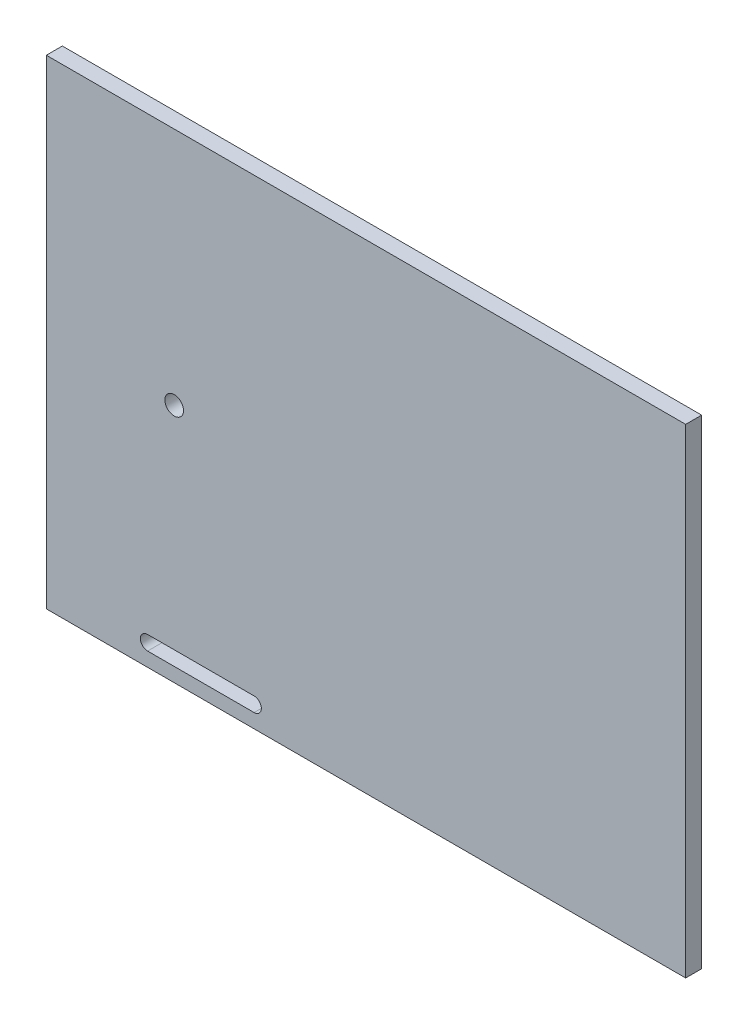
ISO-10303-21;
HEADER;
FILE_DESCRIPTION(('STEP AP214'),'2;1');
FILE_NAME('part.step','',(''),(''),'','','');
FILE_SCHEMA(('AUTOMOTIVE_DESIGN { 1 0 10303 214 1 1 1 1 }'));
ENDSEC;
DATA;
#1=APPLICATION_CONTEXT('core data for automotive mechanical design processes');
#2=APPLICATION_PROTOCOL_DEFINITION('international standard','automotive_design',2000,#1);
#3=PRODUCT_CONTEXT('',#1,'mechanical');
#4=PRODUCT('Part','Part','',(#3));
#5=PRODUCT_RELATED_PRODUCT_CATEGORY('part','',(#4));
#6=PRODUCT_DEFINITION_FORMATION('','',#4);
#7=PRODUCT_DEFINITION_CONTEXT('part definition',#1,'design');
#8=PRODUCT_DEFINITION('design','',#6,#7);
#9=PRODUCT_DEFINITION_SHAPE('','',#8);
#10=(LENGTH_UNIT() NAMED_UNIT(*) SI_UNIT(.MILLI.,.METRE.));
#11=(NAMED_UNIT(*) PLANE_ANGLE_UNIT() SI_UNIT($,.RADIAN.));
#12=(NAMED_UNIT(*) SI_UNIT($,.STERADIAN.) SOLID_ANGLE_UNIT());
#13=UNCERTAINTY_MEASURE_WITH_UNIT(LENGTH_MEASURE(1.E-05),#10,'distance_accuracy_value','');
#14=(GEOMETRIC_REPRESENTATION_CONTEXT(3) GLOBAL_UNCERTAINTY_ASSIGNED_CONTEXT((#13)) GLOBAL_UNIT_ASSIGNED_CONTEXT((#10,
#11,#12)) REPRESENTATION_CONTEXT('',''));
#15=CARTESIAN_POINT('',(0.,0.,0.));
#16=DIRECTION('',(0.,0.,1.));
#17=DIRECTION('',(1.,0.,0.));
#18=AXIS2_PLACEMENT_3D('',#15,#16,#17);
#19=CARTESIAN_POINT('',(120.,0.,3.));
#20=DIRECTION('',(1.,0.,0.));
#21=DIRECTION('',(0.,1.,0.));
#22=AXIS2_PLACEMENT_3D('',#19,#20,#21);
#23=PLANE('',#22);
#24=DIRECTION('',(0.,-1.,0.));
#25=VECTOR('',#24,1.);
#26=CARTESIAN_POINT('',(120.,0.,0.));
#27=LINE('',#26,#25);
#28=CARTESIAN_POINT('',(120.,0.,0.));
#29=VERTEX_POINT('',#28);
#30=CARTESIAN_POINT('',(120.,-90.,0.));
#31=VERTEX_POINT('',#30);
#32=EDGE_CURVE('E154',#29,#31,#27,.T.);
#33=ORIENTED_EDGE('',*,*,#32,.F.);
#34=DIRECTION('',(0.,0.,-1.));
#35=VECTOR('',#34,1.);
#36=CARTESIAN_POINT('',(120.,0.,3.));
#37=LINE('',#36,#35);
#38=CARTESIAN_POINT('',(120.,0.,3.));
#39=VERTEX_POINT('',#38);
#40=EDGE_CURVE('E11',#39,#29,#37,.T.);
#41=ORIENTED_EDGE('',*,*,#40,.F.);
#42=DIRECTION('',(0.,-1.,0.));
#43=VECTOR('',#42,1.);
#44=CARTESIAN_POINT('',(120.,0.,3.));
#45=LINE('',#44,#43);
#46=CARTESIAN_POINT('',(120.,-90.,3.));
#47=VERTEX_POINT('',#46);
#48=EDGE_CURVE('E155',#39,#47,#45,.T.);
#49=ORIENTED_EDGE('',*,*,#48,.T.);
#50=DIRECTION('',(0.,0.,-1.));
#51=VECTOR('',#50,1.);
#52=CARTESIAN_POINT('',(120.,-90.,3.));
#53=LINE('',#52,#51);
#54=EDGE_CURVE('E170',#47,#31,#53,.T.);
#55=ORIENTED_EDGE('',*,*,#54,.T.);
#56=EDGE_LOOP('',(#33,#41,#49,#55));
#57=FACE_BOUND('',#56,.T.);
#58=ADVANCED_FACE('F43',(#57),#23,.T.);
#59=CARTESIAN_POINT('',(0.,0.,3.));
#60=DIRECTION('',(0.,1.,0.));
#61=DIRECTION('',(-1.,0.,0.));
#62=AXIS2_PLACEMENT_3D('',#59,#60,#61);
#63=PLANE('',#62);
#64=DIRECTION('',(1.,0.,0.));
#65=VECTOR('',#64,1.);
#66=CARTESIAN_POINT('',(0.,0.,0.));
#67=LINE('',#66,#65);
#68=CARTESIAN_POINT('',(0.,0.,0.));
#69=VERTEX_POINT('',#68);
#70=EDGE_CURVE('E174',#69,#29,#67,.T.);
#71=ORIENTED_EDGE('',*,*,#70,.F.);
#72=DIRECTION('',(0.,0.,-1.));
#73=VECTOR('',#72,1.);
#74=CARTESIAN_POINT('',(0.,0.,3.));
#75=LINE('',#74,#73);
#76=CARTESIAN_POINT('',(0.,0.,3.));
#77=VERTEX_POINT('',#76);
#78=EDGE_CURVE('E51',#77,#69,#75,.T.);
#79=ORIENTED_EDGE('',*,*,#78,.F.);
#80=DIRECTION('',(1.,0.,0.));
#81=VECTOR('',#80,1.);
#82=CARTESIAN_POINT('',(0.,0.,3.));
#83=LINE('',#82,#81);
#84=EDGE_CURVE('E159',#77,#39,#83,.T.);
#85=ORIENTED_EDGE('',*,*,#84,.T.);
#86=ORIENTED_EDGE('',*,*,#40,.T.);
#87=EDGE_LOOP('',(#71,#79,#85,#86));
#88=FACE_BOUND('',#87,.T.);
#89=ADVANCED_FACE('F201',(#88),#63,.T.);
#90=CARTESIAN_POINT('',(0.,0.,3.));
#91=DIRECTION('',(1.,0.,0.));
#92=DIRECTION('',(0.,1.,0.));
#93=AXIS2_PLACEMENT_3D('',#90,#91,#92);
#94=PLANE('',#93);
#95=DIRECTION('',(0.,-1.,0.));
#96=VECTOR('',#95,1.);
#97=CARTESIAN_POINT('',(0.,0.,0.));
#98=LINE('',#97,#96);
#99=CARTESIAN_POINT('',(0.,-90.,0.));
#100=VERTEX_POINT('',#99);
#101=EDGE_CURVE('E178',#69,#100,#98,.T.);
#102=ORIENTED_EDGE('',*,*,#101,.T.);
#103=DIRECTION('',(0.,0.,-1.));
#104=VECTOR('',#103,1.);
#105=CARTESIAN_POINT('',(0.,-90.,3.));
#106=LINE('',#105,#104);
#107=CARTESIAN_POINT('',(0.,-90.,3.));
#108=VERTEX_POINT('',#107);
#109=EDGE_CURVE('E186',#108,#100,#106,.T.);
#110=ORIENTED_EDGE('',*,*,#109,.F.);
#111=DIRECTION('',(0.,-1.,0.));
#112=VECTOR('',#111,1.);
#113=CARTESIAN_POINT('',(0.,0.,3.));
#114=LINE('',#113,#112);
#115=EDGE_CURVE('E164',#77,#108,#114,.T.);
#116=ORIENTED_EDGE('',*,*,#115,.F.);
#117=ORIENTED_EDGE('',*,*,#78,.T.);
#118=EDGE_LOOP('',(#102,#110,#116,#117));
#119=FACE_BOUND('',#118,.T.);
#120=ADVANCED_FACE('F193',(#119),#94,.F.);
#121=CARTESIAN_POINT('',(0.,-90.,3.));
#122=DIRECTION('',(0.,1.,0.));
#123=DIRECTION('',(-1.,0.,0.));
#124=AXIS2_PLACEMENT_3D('',#121,#122,#123);
#125=PLANE('',#124);
#126=DIRECTION('',(1.,0.,0.));
#127=VECTOR('',#126,1.);
#128=CARTESIAN_POINT('',(0.,-90.,0.));
#129=LINE('',#128,#127);
#130=EDGE_CURVE('E160',#100,#31,#129,.T.);
#131=ORIENTED_EDGE('',*,*,#130,.T.);
#132=ORIENTED_EDGE('',*,*,#54,.F.);
#133=DIRECTION('',(1.,0.,0.));
#134=VECTOR('',#133,1.);
#135=CARTESIAN_POINT('',(0.,-90.,3.));
#136=LINE('',#135,#134);
#137=EDGE_CURVE('E167',#108,#47,#136,.T.);
#138=ORIENTED_EDGE('',*,*,#137,.F.);
#139=ORIENTED_EDGE('',*,*,#109,.T.);
#140=EDGE_LOOP('',(#131,#132,#138,#139));
#141=FACE_BOUND('',#140,.T.);
#142=ADVANCED_FACE('F208',(#141),#125,.F.);
#143=CARTESIAN_POINT('',(0.,0.,3.));
#144=DIRECTION('',(0.,0.,1.));
#145=DIRECTION('',(1.,0.,0.));
#146=AXIS2_PLACEMENT_3D('',#143,#144,#145);
#147=PLANE('',#146);
#148=DIRECTION('',(1.,0.,0.));
#149=VECTOR('',#148,1.);
#150=CARTESIAN_POINT('',(0.,-87.35,3.));
#151=LINE('',#150,#149);
#152=CARTESIAN_POINT('',(19.,-87.35,3.));
#153=VERTEX_POINT('',#152);
#154=CARTESIAN_POINT('',(39.,-87.35,3.));
#155=VERTEX_POINT('',#154);
#156=EDGE_CURVE('E58',#153,#155,#151,.T.);
#157=ORIENTED_EDGE('',*,*,#156,.F.);
#158=CARTESIAN_POINT('',(19.,-86.,3.));
#159=DIRECTION('',(0.,0.,1.));
#160=DIRECTION('',(1.,0.,0.));
#161=AXIS2_PLACEMENT_3D('',#158,#159,#160);
#162=CIRCLE('',#161,1.35);
#163=CARTESIAN_POINT('',(19.,-84.65,3.));
#164=VERTEX_POINT('',#163);
#165=EDGE_CURVE('E128',#164,#153,#162,.T.);
#166=ORIENTED_EDGE('',*,*,#165,.F.);
#167=DIRECTION('',(1.,0.,0.));
#168=VECTOR('',#167,1.);
#169=CARTESIAN_POINT('',(0.,-84.65,3.));
#170=LINE('',#169,#168);
#171=CARTESIAN_POINT('',(39.,-84.65,3.));
#172=VERTEX_POINT('',#171);
#173=EDGE_CURVE('E110',#164,#172,#170,.T.);
#174=ORIENTED_EDGE('',*,*,#173,.T.);
#175=CARTESIAN_POINT('',(39.,-86.,3.));
#176=DIRECTION('',(0.,0.,1.));
#177=DIRECTION('',(1.,0.,0.));
#178=AXIS2_PLACEMENT_3D('',#175,#176,#177);
#179=CIRCLE('',#178,1.35);
#180=EDGE_CURVE('E120',#155,#172,#179,.T.);
#181=ORIENTED_EDGE('',*,*,#180,.F.);
#182=EDGE_LOOP('',(#157,#166,#174,#181));
#183=FACE_BOUND('',#182,.T.);
#184=CARTESIAN_POINT('',(24.,-44.9,3.));
#185=DIRECTION('',(0.,0.,1.));
#186=DIRECTION('',(1.,0.,0.));
#187=AXIS2_PLACEMENT_3D('',#184,#185,#186);
#188=CIRCLE('',#187,1.75);
#189=CARTESIAN_POINT('',(25.75,-44.9,3.));
#190=VERTEX_POINT('',#189);
#191=EDGE_CURVE('E145',#190,#190,#188,.T.);
#192=ORIENTED_EDGE('',*,*,#191,.F.);
#193=EDGE_LOOP('',(#192));
#194=FACE_BOUND('',#193,.T.);
#195=ORIENTED_EDGE('',*,*,#48,.F.);
#196=ORIENTED_EDGE('',*,*,#84,.F.);
#197=ORIENTED_EDGE('',*,*,#115,.T.);
#198=ORIENTED_EDGE('',*,*,#137,.T.);
#199=EDGE_LOOP('',(#195,#196,#197,#198));
#200=FACE_BOUND('',#199,.T.);
#201=ADVANCED_FACE('F125',(#183,#194,#200),#147,.T.);
#202=CARTESIAN_POINT('',(0.,0.,0.));
#203=DIRECTION('',(0.,0.,1.));
#204=DIRECTION('',(1.,0.,0.));
#205=AXIS2_PLACEMENT_3D('',#202,#203,#204);
#206=PLANE('',#205);
#207=CARTESIAN_POINT('',(19.,-86.,0.));
#208=DIRECTION('',(0.,0.,1.));
#209=DIRECTION('',(1.,0.,0.));
#210=AXIS2_PLACEMENT_3D('',#207,#208,#209);
#211=CIRCLE('',#210,1.35);
#212=CARTESIAN_POINT('',(19.,-87.35,0.));
#213=VERTEX_POINT('',#212);
#214=CARTESIAN_POINT('',(19.,-84.65,0.));
#215=VERTEX_POINT('',#214);
#216=EDGE_CURVE('E294',#213,#215,#211,.F.);
#217=ORIENTED_EDGE('',*,*,#216,.F.);
#218=DIRECTION('',(-1.,0.,0.));
#219=VECTOR('',#218,1.);
#220=CARTESIAN_POINT('',(0.,-87.35,0.));
#221=LINE('',#220,#219);
#222=CARTESIAN_POINT('',(39.,-87.35,0.));
#223=VERTEX_POINT('',#222);
#224=EDGE_CURVE('E146',#223,#213,#221,.T.);
#225=ORIENTED_EDGE('',*,*,#224,.F.);
#226=CARTESIAN_POINT('',(39.,-86.,0.));
#227=DIRECTION('',(0.,0.,1.));
#228=DIRECTION('',(1.,0.,0.));
#229=AXIS2_PLACEMENT_3D('',#226,#227,#228);
#230=CIRCLE('',#229,1.35);
#231=CARTESIAN_POINT('',(39.,-84.65,0.));
#232=VERTEX_POINT('',#231);
#233=EDGE_CURVE('E142',#232,#223,#230,.F.);
#234=ORIENTED_EDGE('',*,*,#233,.F.);
#235=DIRECTION('',(-1.,0.,0.));
#236=VECTOR('',#235,1.);
#237=CARTESIAN_POINT('',(0.,-84.65,0.));
#238=LINE('',#237,#236);
#239=EDGE_CURVE('E113',#232,#215,#238,.T.);
#240=ORIENTED_EDGE('',*,*,#239,.T.);
#241=EDGE_LOOP('',(#217,#225,#234,#240));
#242=FACE_BOUND('',#241,.T.);
#243=CARTESIAN_POINT('',(24.,-44.9,0.));
#244=DIRECTION('',(0.,0.,1.));
#245=DIRECTION('',(1.,0.,0.));
#246=AXIS2_PLACEMENT_3D('',#243,#244,#245);
#247=CIRCLE('',#246,1.75);
#248=CARTESIAN_POINT('',(25.75,-44.9,0.));
#249=VERTEX_POINT('',#248);
#250=EDGE_CURVE('E150',#249,#249,#247,.F.);
#251=ORIENTED_EDGE('',*,*,#250,.F.);
#252=EDGE_LOOP('',(#251));
#253=FACE_BOUND('',#252,.T.);
#254=ORIENTED_EDGE('',*,*,#32,.T.);
#255=ORIENTED_EDGE('',*,*,#130,.F.);
#256=ORIENTED_EDGE('',*,*,#101,.F.);
#257=ORIENTED_EDGE('',*,*,#70,.T.);
#258=EDGE_LOOP('',(#254,#255,#256,#257));
#259=FACE_BOUND('',#258,.T.);
#260=ADVANCED_FACE('F200',(#242,#253,#259),#206,.F.);
#261=CARTESIAN_POINT('',(24.,-44.9,-4.94974746830584));
#262=DIRECTION('',(0.,0.,1.));
#263=DIRECTION('',(1.,0.,0.));
#264=AXIS2_PLACEMENT_3D('',#261,#262,#263);
#265=CYLINDRICAL_SURFACE('',#264,1.75);
#266=ORIENTED_EDGE('',*,*,#250,.T.);
#267=EDGE_LOOP('',(#266));
#268=FACE_BOUND('',#267,.T.);
#269=ORIENTED_EDGE('',*,*,#191,.T.);
#270=EDGE_LOOP('',(#269));
#271=FACE_BOUND('',#270,.T.);
#272=ADVANCED_FACE('F216',(#268,#271),#265,.F.);
#273=CARTESIAN_POINT('',(0.,-87.35,-22.8600087489047));
#274=DIRECTION('',(0.,-1.,0.));
#275=DIRECTION('',(0.,0.,-1.));
#276=AXIS2_PLACEMENT_3D('',#273,#274,#275);
#277=PLANE('',#276);
#278=ORIENTED_EDGE('',*,*,#224,.T.);
#279=DIRECTION('',(0.,0.,1.));
#280=VECTOR('',#279,1.);
#281=CARTESIAN_POINT('',(19.,-87.35,-22.8600087489047));
#282=LINE('',#281,#280);
#283=EDGE_CURVE('E135',#213,#153,#282,.T.);
#284=ORIENTED_EDGE('',*,*,#283,.T.);
#285=ORIENTED_EDGE('',*,*,#156,.T.);
#286=DIRECTION('',(0.,0.,1.));
#287=VECTOR('',#286,1.);
#288=CARTESIAN_POINT('',(39.,-87.35,-22.8600087489047));
#289=LINE('',#288,#287);
#290=EDGE_CURVE('E117',#223,#155,#289,.T.);
#291=ORIENTED_EDGE('',*,*,#290,.F.);
#292=EDGE_LOOP('',(#278,#284,#285,#291));
#293=FACE_BOUND('',#292,.T.);
#294=ADVANCED_FACE('F244',(#293),#277,.F.);
#295=CARTESIAN_POINT('',(19.,-86.,-22.8600087489047));
#296=DIRECTION('',(0.,0.,1.));
#297=DIRECTION('',(1.,0.,0.));
#298=AXIS2_PLACEMENT_3D('',#295,#296,#297);
#299=CYLINDRICAL_SURFACE('',#298,1.35);
#300=ORIENTED_EDGE('',*,*,#216,.T.);
#301=DIRECTION('',(0.,0.,1.));
#302=VECTOR('',#301,1.);
#303=CARTESIAN_POINT('',(19.,-84.65,-22.8600087489047));
#304=LINE('',#303,#302);
#305=EDGE_CURVE('E116',#215,#164,#304,.T.);
#306=ORIENTED_EDGE('',*,*,#305,.T.);
#307=ORIENTED_EDGE('',*,*,#165,.T.);
#308=ORIENTED_EDGE('',*,*,#283,.F.);
#309=EDGE_LOOP('',(#300,#306,#307,#308));
#310=FACE_BOUND('',#309,.T.);
#311=ADVANCED_FACE('F263',(#310),#299,.F.);
#312=CARTESIAN_POINT('',(0.,-84.65,-22.8600087489047));
#313=DIRECTION('',(0.,-1.,0.));
#314=DIRECTION('',(0.,0.,-1.));
#315=AXIS2_PLACEMENT_3D('',#312,#313,#314);
#316=PLANE('',#315);
#317=DIRECTION('',(0.,0.,1.));
#318=VECTOR('',#317,1.);
#319=CARTESIAN_POINT('',(39.,-84.65,-22.8600087489047));
#320=LINE('',#319,#318);
#321=EDGE_CURVE('E66',#232,#172,#320,.T.);
#322=ORIENTED_EDGE('',*,*,#321,.T.);
#323=ORIENTED_EDGE('',*,*,#173,.F.);
#324=ORIENTED_EDGE('',*,*,#305,.F.);
#325=ORIENTED_EDGE('',*,*,#239,.F.);
#326=EDGE_LOOP('',(#322,#323,#324,#325));
#327=FACE_BOUND('',#326,.T.);
#328=ADVANCED_FACE('F107',(#327),#316,.T.);
#329=CARTESIAN_POINT('',(39.,-86.,-22.8600087489047));
#330=DIRECTION('',(0.,0.,1.));
#331=DIRECTION('',(1.,0.,0.));
#332=AXIS2_PLACEMENT_3D('',#329,#330,#331);
#333=CYLINDRICAL_SURFACE('',#332,1.35);
#334=ORIENTED_EDGE('',*,*,#233,.T.);
#335=ORIENTED_EDGE('',*,*,#290,.T.);
#336=ORIENTED_EDGE('',*,*,#180,.T.);
#337=ORIENTED_EDGE('',*,*,#321,.F.);
#338=EDGE_LOOP('',(#334,#335,#336,#337));
#339=FACE_BOUND('',#338,.T.);
#340=ADVANCED_FACE('F121',(#339),#333,.F.);
#341=CLOSED_SHELL('',(#58,#89,#120,#142,#201,#260,#272,#294,#311,#328,#340));
#342=MANIFOLD_SOLID_BREP('B2',#341);
#343=ADVANCED_BREP_SHAPE_REPRESENTATION('',(#18,#342),#14);
#344=SHAPE_DEFINITION_REPRESENTATION(#9,#343);
ENDSEC;
END-ISO-10303-21;
